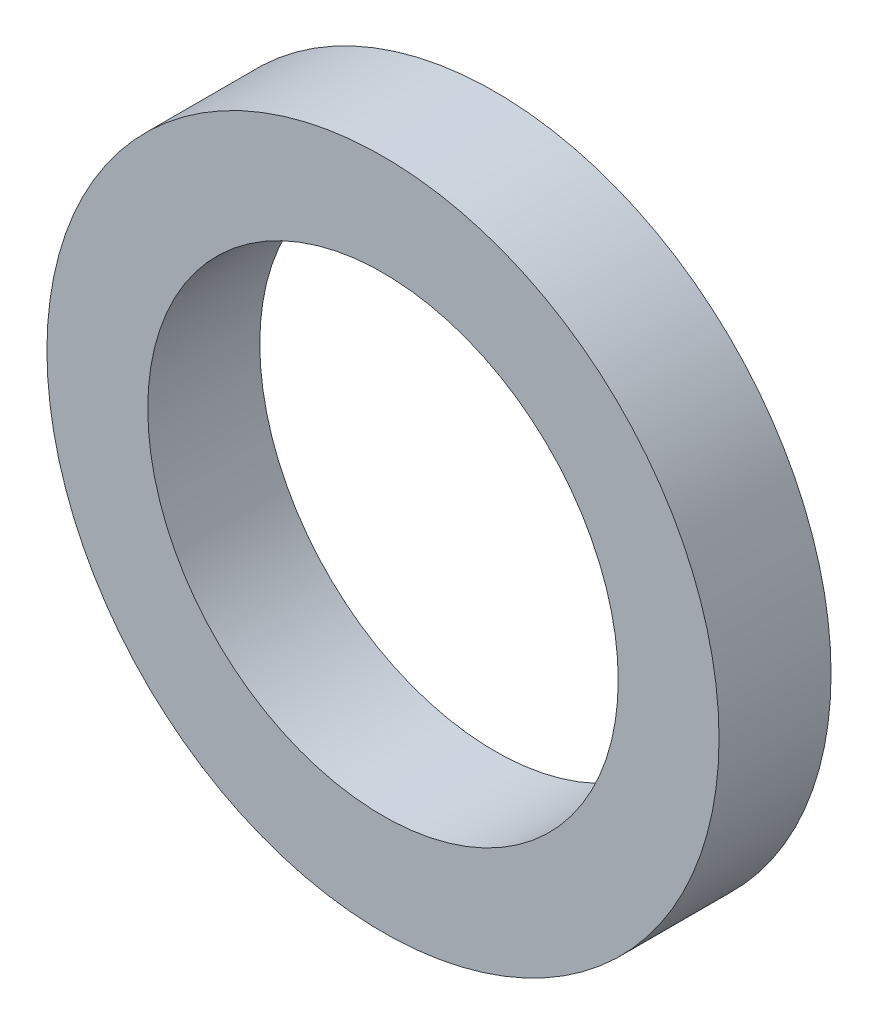
ISO-10303-21;
HEADER;
FILE_DESCRIPTION(('STEP AP214'),'2;1');
FILE_NAME('part.step','',(''),(''),'','','');
FILE_SCHEMA(('AUTOMOTIVE_DESIGN { 1 0 10303 214 1 1 1 1 }'));
ENDSEC;
DATA;
#1=APPLICATION_CONTEXT('core data for automotive mechanical design processes');
#2=APPLICATION_PROTOCOL_DEFINITION('international standard','automotive_design',2000,#1);
#3=PRODUCT_CONTEXT('',#1,'mechanical');
#4=PRODUCT('Part','Part','',(#3));
#5=PRODUCT_RELATED_PRODUCT_CATEGORY('part','',(#4));
#6=PRODUCT_DEFINITION_FORMATION('','',#4);
#7=PRODUCT_DEFINITION_CONTEXT('part definition',#1,'design');
#8=PRODUCT_DEFINITION('design','',#6,#7);
#9=PRODUCT_DEFINITION_SHAPE('','',#8);
#10=(LENGTH_UNIT() NAMED_UNIT(*) SI_UNIT(.MILLI.,.METRE.));
#11=(NAMED_UNIT(*) PLANE_ANGLE_UNIT() SI_UNIT($,.RADIAN.));
#12=(NAMED_UNIT(*) SI_UNIT($,.STERADIAN.) SOLID_ANGLE_UNIT());
#13=UNCERTAINTY_MEASURE_WITH_UNIT(LENGTH_MEASURE(1.E-05),#10,'distance_accuracy_value','');
#14=(GEOMETRIC_REPRESENTATION_CONTEXT(3) GLOBAL_UNCERTAINTY_ASSIGNED_CONTEXT((#13)) GLOBAL_UNIT_ASSIGNED_CONTEXT((#10,
#11,#12)) REPRESENTATION_CONTEXT('',''));
#15=CARTESIAN_POINT('',(0.,0.,0.));
#16=DIRECTION('',(0.,0.,1.));
#17=DIRECTION('',(1.,0.,0.));
#18=AXIS2_PLACEMENT_3D('',#15,#16,#17);
#19=CARTESIAN_POINT('',(0.,0.,0.5));
#20=DIRECTION('',(0.,0.,1.));
#21=DIRECTION('',(1.,0.,0.));
#22=AXIS2_PLACEMENT_3D('',#19,#20,#21);
#23=PLANE('',#22);
#24=CARTESIAN_POINT('',(0.,0.,0.5));
#25=DIRECTION('',(0.,0.,1.));
#26=DIRECTION('',(1.,0.,0.));
#27=AXIS2_PLACEMENT_3D('',#24,#25,#26);
#28=CIRCLE('',#27,1.5);
#29=CARTESIAN_POINT('',(1.5,0.,0.5));
#30=VERTEX_POINT('',#29);
#31=EDGE_CURVE('E10',#30,#30,#28,.T.);
#32=ORIENTED_EDGE('',*,*,#31,.T.);
#33=EDGE_LOOP('',(#32));
#34=FACE_BOUND('',#33,.T.);
#35=CARTESIAN_POINT('',(0.,0.,0.5));
#36=DIRECTION('',(0.,0.,1.));
#37=DIRECTION('',(1.,0.,0.));
#38=AXIS2_PLACEMENT_3D('',#35,#36,#37);
#39=CIRCLE('',#38,1.05);
#40=CARTESIAN_POINT('',(1.05,0.,0.5));
#41=VERTEX_POINT('',#40);
#42=EDGE_CURVE('E49',#41,#41,#39,.T.);
#43=ORIENTED_EDGE('',*,*,#42,.F.);
#44=EDGE_LOOP('',(#43));
#45=FACE_BOUND('',#44,.T.);
#46=ADVANCED_FACE('F39',(#34,#45),#23,.T.);
#47=CARTESIAN_POINT('',(0.,0.,0.));
#48=DIRECTION('',(0.,0.,1.));
#49=DIRECTION('',(1.,0.,0.));
#50=AXIS2_PLACEMENT_3D('',#47,#48,#49);
#51=PLANE('',#50);
#52=CARTESIAN_POINT('',(0.,0.,0.));
#53=DIRECTION('',(0.,0.,1.));
#54=DIRECTION('',(1.,0.,0.));
#55=AXIS2_PLACEMENT_3D('',#52,#53,#54);
#56=CIRCLE('',#55,1.5);
#57=CARTESIAN_POINT('',(1.5,0.,0.));
#58=VERTEX_POINT('',#57);
#59=EDGE_CURVE('E43',#58,#58,#56,.T.);
#60=ORIENTED_EDGE('',*,*,#59,.F.);
#61=EDGE_LOOP('',(#60));
#62=FACE_BOUND('',#61,.T.);
#63=CARTESIAN_POINT('',(0.,0.,0.));
#64=DIRECTION('',(0.,0.,1.));
#65=DIRECTION('',(1.,0.,0.));
#66=AXIS2_PLACEMENT_3D('',#63,#64,#65);
#67=CIRCLE('',#66,1.05);
#68=CARTESIAN_POINT('',(1.05,0.,0.));
#69=VERTEX_POINT('',#68);
#70=EDGE_CURVE('E55',#69,#69,#67,.T.);
#71=ORIENTED_EDGE('',*,*,#70,.T.);
#72=EDGE_LOOP('',(#71));
#73=FACE_BOUND('',#72,.T.);
#74=ADVANCED_FACE('F65',(#62,#73),#51,.F.);
#75=CARTESIAN_POINT('',(0.,0.,0.5));
#76=DIRECTION('',(0.,0.,-1.));
#77=DIRECTION('',(-1.,0.,0.));
#78=AXIS2_PLACEMENT_3D('',#75,#76,#77);
#79=CYLINDRICAL_SURFACE('',#78,1.5);
#80=ORIENTED_EDGE('',*,*,#31,.F.);
#81=EDGE_LOOP('',(#80));
#82=FACE_BOUND('',#81,.T.);
#83=ORIENTED_EDGE('',*,*,#59,.T.);
#84=EDGE_LOOP('',(#83));
#85=FACE_BOUND('',#84,.T.);
#86=ADVANCED_FACE('F41',(#82,#85),#79,.T.);
#87=CARTESIAN_POINT('',(0.,0.,0.5));
#88=DIRECTION('',(0.,0.,-1.));
#89=DIRECTION('',(-1.,0.,0.));
#90=AXIS2_PLACEMENT_3D('',#87,#88,#89);
#91=CYLINDRICAL_SURFACE('',#90,1.05);
#92=ORIENTED_EDGE('',*,*,#42,.T.);
#93=EDGE_LOOP('',(#92));
#94=FACE_BOUND('',#93,.T.);
#95=ORIENTED_EDGE('',*,*,#70,.F.);
#96=EDGE_LOOP('',(#95));
#97=FACE_BOUND('',#96,.T.);
#98=ADVANCED_FACE('F59',(#94,#97),#91,.F.);
#99=CLOSED_SHELL('',(#46,#74,#86,#98));
#100=MANIFOLD_SOLID_BREP('B2',#99);
#101=ADVANCED_BREP_SHAPE_REPRESENTATION('',(#18,#100),#14);
#102=SHAPE_DEFINITION_REPRESENTATION(#9,#101);
ENDSEC;
END-ISO-10303-21;
